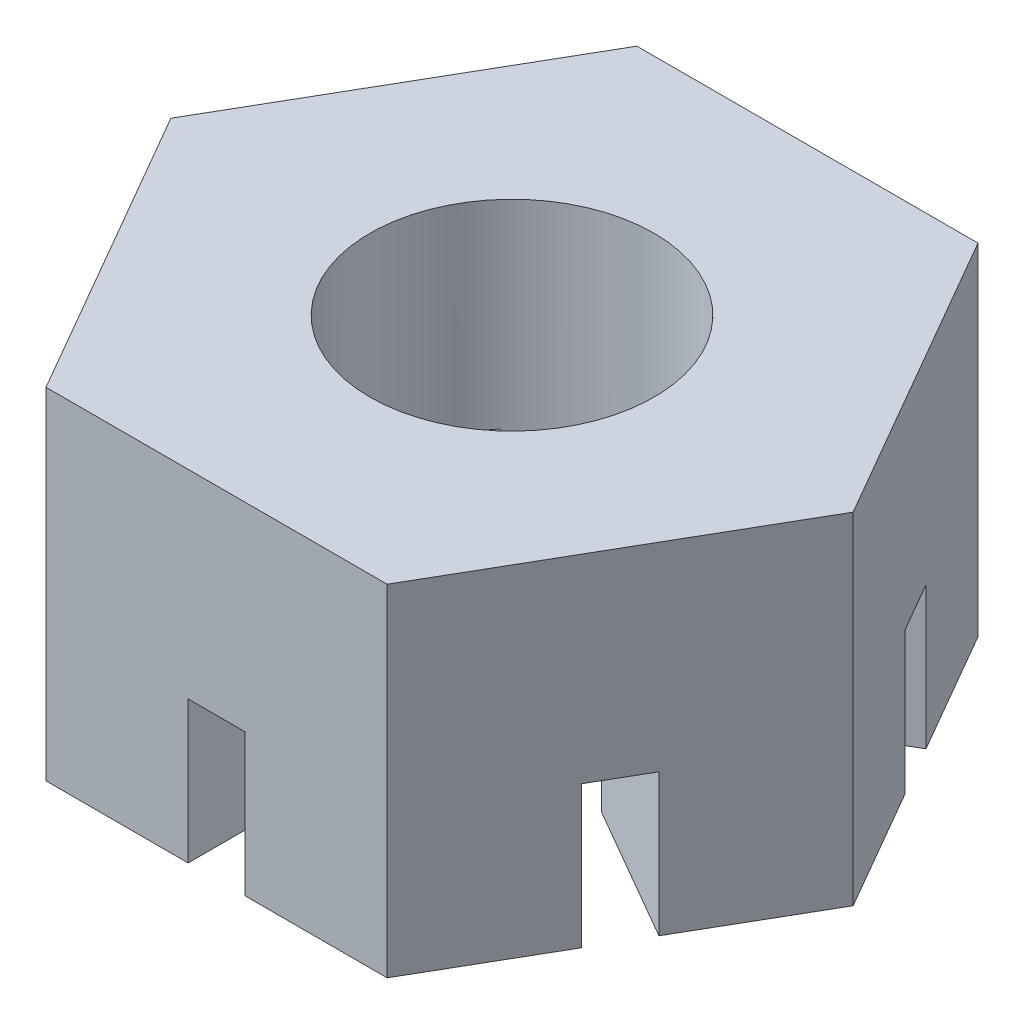
ISO-10303-21;
HEADER;
FILE_DESCRIPTION(('STEP AP214'),'2;1');
FILE_NAME('part.step','',(''),(''),'','','');
FILE_SCHEMA(('AUTOMOTIVE_DESIGN { 1 0 10303 214 1 1 1 1 }'));
ENDSEC;
DATA;
#1=APPLICATION_CONTEXT('core data for automotive mechanical design processes');
#2=APPLICATION_PROTOCOL_DEFINITION('international standard','automotive_design',2000,#1);
#3=PRODUCT_CONTEXT('',#1,'mechanical');
#4=PRODUCT('Part','Part','',(#3));
#5=PRODUCT_RELATED_PRODUCT_CATEGORY('part','',(#4));
#6=PRODUCT_DEFINITION_FORMATION('','',#4);
#7=PRODUCT_DEFINITION_CONTEXT('part definition',#1,'design');
#8=PRODUCT_DEFINITION('design','',#6,#7);
#9=PRODUCT_DEFINITION_SHAPE('','',#8);
#10=(LENGTH_UNIT() NAMED_UNIT(*) SI_UNIT(.MILLI.,.METRE.));
#11=(NAMED_UNIT(*) PLANE_ANGLE_UNIT() SI_UNIT($,.RADIAN.));
#12=(NAMED_UNIT(*) SI_UNIT($,.STERADIAN.) SOLID_ANGLE_UNIT());
#13=UNCERTAINTY_MEASURE_WITH_UNIT(LENGTH_MEASURE(1.E-05),#10,'distance_accuracy_value','');
#14=(GEOMETRIC_REPRESENTATION_CONTEXT(3) GLOBAL_UNCERTAINTY_ASSIGNED_CONTEXT((#13)) GLOBAL_UNIT_ASSIGNED_CONTEXT((#10,
#11,#12)) REPRESENTATION_CONTEXT('',''));
#15=CARTESIAN_POINT('',(0.,0.,0.));
#16=DIRECTION('',(0.,0.,1.));
#17=DIRECTION('',(1.,0.,0.));
#18=AXIS2_PLACEMENT_3D('',#15,#16,#17);
#19=CARTESIAN_POINT('',(0.,0.,0.));
#20=DIRECTION('',(0.,1.,0.));
#21=DIRECTION('',(0.,0.,1.));
#22=AXIS2_PLACEMENT_3D('',#19,#20,#21);
#23=PLANE('',#22);
#24=DIRECTION('',(0.866025403784438,0.,-0.500000000000001));
#25=VECTOR('',#24,1.);
#26=CARTESIAN_POINT('',(2.50000000000116,0.,4.33012701892419));
#27=LINE('',#26,#25);
#28=CARTESIAN_POINT('',(-42.5333209967897,0.,30.3301270189242));
#29=VERTEX_POINT('',#28);
#30=CARTESIAN_POINT('',(-18.7132034355949,0.,16.5775757328399));
#31=VERTEX_POINT('',#30);
#32=EDGE_CURVE('E281',#29,#31,#27,.T.);
#33=ORIENTED_EDGE('',*,*,#32,.T.);
#34=CARTESIAN_POINT('',(0.,0.,0.));
#35=DIRECTION('',(0.,1.,0.));
#36=DIRECTION('',(0.,0.,1.));
#37=AXIS2_PLACEMENT_3D('',#34,#35,#36);
#38=CIRCLE('',#37,25.);
#39=CARTESIAN_POINT('',(-4.99999999999651,0.,24.4948974278311));
#40=VERTEX_POINT('',#39);
#41=EDGE_CURVE('E401',#31,#40,#38,.T.);
#42=ORIENTED_EDGE('',*,*,#41,.T.);
#43=DIRECTION('',(0.,0.,-1.));
#44=VECTOR('',#43,1.);
#45=CARTESIAN_POINT('',(-4.99999999999652,0.,0.));
#46=LINE('',#45,#44);
#47=CARTESIAN_POINT('',(-4.99999999999651,0.,52.));
#48=VERTEX_POINT('',#47);
#49=EDGE_CURVE('E315',#48,#40,#46,.T.);
#50=ORIENTED_EDGE('',*,*,#49,.F.);
#51=DIRECTION('',(1.,0.,0.));
#52=VECTOR('',#51,1.);
#53=CARTESIAN_POINT('',(0.,0.,52.));
#54=LINE('',#53,#52);
#55=CARTESIAN_POINT('',(-30.0222139978606,0.,52.));
#56=VERTEX_POINT('',#55);
#57=EDGE_CURVE('E406',#56,#48,#54,.T.);
#58=ORIENTED_EDGE('',*,*,#57,.F.);
#59=DIRECTION('',(0.5,0.,0.866025403784439));
#60=VECTOR('',#59,1.);
#61=CARTESIAN_POINT('',(-45.0333209967908,0.,26.));
#62=LINE('',#61,#60);
#63=EDGE_CURVE('E440',#29,#56,#62,.T.);
#64=ORIENTED_EDGE('',*,*,#63,.F.);
#65=EDGE_LOOP('',(#33,#42,#50,#58,#64));
#66=FACE_BOUND('',#65,.T.);
#67=ADVANCED_FACE('F39',(#66),#23,.F.);
#68=DIRECTION('',(0.,0.,-1.));
#69=VECTOR('',#68,1.);
#70=CARTESIAN_POINT('',(5.00000000000348,0.,0.));
#71=LINE('',#70,#69);
#72=CARTESIAN_POINT('',(5.00000000000349,0.,52.));
#73=VERTEX_POINT('',#72);
#74=CARTESIAN_POINT('',(5.00000000000349,0.,24.4948974278311));
#75=VERTEX_POINT('',#74);
#76=EDGE_CURVE('E306',#73,#75,#71,.T.);
#77=ORIENTED_EDGE('',*,*,#76,.T.);
#78=CARTESIAN_POINT('',(18.7132034355987,0.,16.5775757328361));
#79=VERTEX_POINT('',#78);
#80=EDGE_CURVE('E420',#75,#79,#38,.T.);
#81=ORIENTED_EDGE('',*,*,#80,.T.);
#82=DIRECTION('',(-0.866025403784439,0.,-0.5));
#83=VECTOR('',#82,1.);
#84=CARTESIAN_POINT('',(-2.49999999999855,0.,4.33012701891968));
#85=LINE('',#84,#83);
#86=CARTESIAN_POINT('',(42.5333209967923,0.,30.3301270189197));
#87=VERTEX_POINT('',#86);
#88=EDGE_CURVE('E341',#87,#79,#85,.T.);
#89=ORIENTED_EDGE('',*,*,#88,.F.);
#90=DIRECTION('',(0.5,0.,-0.866025403784439));
#91=VECTOR('',#90,1.);
#92=CARTESIAN_POINT('',(45.0333209967908,0.,26.));
#93=LINE('',#92,#91);
#94=CARTESIAN_POINT('',(30.0222139978606,0.,52.));
#95=VERTEX_POINT('',#94);
#96=EDGE_CURVE('E425',#95,#87,#93,.T.);
#97=ORIENTED_EDGE('',*,*,#96,.F.);
#98=EDGE_CURVE('E444',#73,#95,#54,.T.);
#99=ORIENTED_EDGE('',*,*,#98,.F.);
#100=EDGE_LOOP('',(#77,#81,#89,#97,#99));
#101=FACE_BOUND('',#100,.T.);
#102=ADVANCED_FACE('F543',(#101),#23,.F.);
#103=DIRECTION('',(-0.866025403784439,0.,-0.5));
#104=VECTOR('',#103,1.);
#105=CARTESIAN_POINT('',(2.50000000000145,0.,-4.33012701892471));
#106=LINE('',#105,#104);
#107=CARTESIAN_POINT('',(47.5333209967923,0.,21.6698729810753));
#108=VERTEX_POINT('',#107);
#109=CARTESIAN_POINT('',(23.7132034355974,0.,7.91732169499087));
#110=VERTEX_POINT('',#109);
#111=EDGE_CURVE('E332',#108,#110,#106,.T.);
#112=ORIENTED_EDGE('',*,*,#111,.T.);
#113=CARTESIAN_POINT('',(23.7132034355964,0.,-7.91732169499363));
#114=VERTEX_POINT('',#113);
#115=EDGE_CURVE('E424',#110,#114,#38,.T.);
#116=ORIENTED_EDGE('',*,*,#115,.T.);
#117=DIRECTION('',(-0.86602540378444,0.,0.499999999999998));
#118=VECTOR('',#117,1.);
#119=CARTESIAN_POINT('',(2.5,0.,4.33012701892221));
#120=LINE('',#119,#118);
#121=CARTESIAN_POINT('',(47.5333209967909,0.,-21.6698729810777));
#122=VERTEX_POINT('',#121);
#123=EDGE_CURVE('E247',#122,#114,#120,.T.);
#124=ORIENTED_EDGE('',*,*,#123,.F.);
#125=DIRECTION('',(-0.5,0.,-0.866025403784439));
#126=VECTOR('',#125,1.);
#127=CARTESIAN_POINT('',(45.0333209967908,0.,-26.));
#128=LINE('',#127,#126);
#129=CARTESIAN_POINT('',(60.0444279957211,0.,0.));
#130=VERTEX_POINT('',#129);
#131=EDGE_CURVE('E429',#130,#122,#128,.T.);
#132=ORIENTED_EDGE('',*,*,#131,.F.);
#133=EDGE_CURVE('E423',#108,#130,#93,.T.);
#134=ORIENTED_EDGE('',*,*,#133,.F.);
#135=EDGE_LOOP('',(#112,#116,#124,#132,#134));
#136=FACE_BOUND('',#135,.T.);
#137=ADVANCED_FACE('F548',(#136),#23,.F.);
#138=DIRECTION('',(-0.86602540378444,0.,0.499999999999998));
#139=VECTOR('',#138,1.);
#140=CARTESIAN_POINT('',(-2.49999999999998,0.,-4.33012701892218));
#141=LINE('',#140,#139);
#142=CARTESIAN_POINT('',(42.5333209967909,0.,-30.3301270189221));
#143=VERTEX_POINT('',#142);
#144=CARTESIAN_POINT('',(18.7132034355965,0.,-16.577575732838));
#145=VERTEX_POINT('',#144);
#146=EDGE_CURVE('E358',#143,#145,#141,.T.);
#147=ORIENTED_EDGE('',*,*,#146,.T.);
#148=CARTESIAN_POINT('',(5.00000000000001,0.,-24.4948974278318));
#149=VERTEX_POINT('',#148);
#150=EDGE_CURVE('E468',#145,#149,#38,.T.);
#151=ORIENTED_EDGE('',*,*,#150,.T.);
#152=DIRECTION('',(0.,0.,1.));
#153=VECTOR('',#152,1.);
#154=CARTESIAN_POINT('',(5.00000000000001,0.,0.));
#155=LINE('',#154,#153);
#156=CARTESIAN_POINT('',(5.00000000000001,0.,-52.));
#157=VERTEX_POINT('',#156);
#158=EDGE_CURVE('E242',#157,#149,#155,.T.);
#159=ORIENTED_EDGE('',*,*,#158,.F.);
#160=DIRECTION('',(-1.,0.,0.));
#161=VECTOR('',#160,1.);
#162=CARTESIAN_POINT('',(0.,0.,-52.));
#163=LINE('',#162,#161);
#164=CARTESIAN_POINT('',(30.0222139978606,0.,-52.));
#165=VERTEX_POINT('',#164);
#166=EDGE_CURVE('E433',#165,#157,#163,.T.);
#167=ORIENTED_EDGE('',*,*,#166,.F.);
#168=EDGE_CURVE('E428',#143,#165,#128,.T.);
#169=ORIENTED_EDGE('',*,*,#168,.F.);
#170=EDGE_LOOP('',(#147,#151,#159,#167,#169));
#171=FACE_BOUND('',#170,.T.);
#172=ADVANCED_FACE('F467',(#171),#23,.F.);
#173=DIRECTION('',(0.,0.,1.));
#174=VECTOR('',#173,1.);
#175=CARTESIAN_POINT('',(-4.99999999999999,0.,0.));
#176=LINE('',#175,#174);
#177=CARTESIAN_POINT('',(-4.99999999999999,0.,-52.));
#178=VERTEX_POINT('',#177);
#179=CARTESIAN_POINT('',(-4.99999999999999,0.,-24.4948974278318));
#180=VERTEX_POINT('',#179);
#181=EDGE_CURVE('E263',#178,#180,#176,.T.);
#182=ORIENTED_EDGE('',*,*,#181,.T.);
#183=CARTESIAN_POINT('',(-18.7132034355962,0.,-16.5775757328383));
#184=VERTEX_POINT('',#183);
#185=EDGE_CURVE('E470',#180,#184,#38,.T.);
#186=ORIENTED_EDGE('',*,*,#185,.T.);
#187=DIRECTION('',(0.866025403784433,0.,0.50000000000001));
#188=VECTOR('',#187,1.);
#189=CARTESIAN_POINT('',(2.50000000000006,0.,-4.33012701892217));
#190=LINE('',#189,#188);
#191=CARTESIAN_POINT('',(-42.5333209967905,0.,-30.3301270189227));
#192=VERTEX_POINT('',#191);
#193=EDGE_CURVE('E301',#192,#184,#190,.T.);
#194=ORIENTED_EDGE('',*,*,#193,.F.);
#195=DIRECTION('',(-0.5,0.,0.866025403784439));
#196=VECTOR('',#195,1.);
#197=CARTESIAN_POINT('',(-45.0333209967908,0.,-26.));
#198=LINE('',#197,#196);
#199=CARTESIAN_POINT('',(-30.0222139978606,0.,-52.));
#200=VERTEX_POINT('',#199);
#201=EDGE_CURVE('E437',#200,#192,#198,.T.);
#202=ORIENTED_EDGE('',*,*,#201,.F.);
#203=EDGE_CURVE('E432',#178,#200,#163,.T.);
#204=ORIENTED_EDGE('',*,*,#203,.F.);
#205=EDGE_LOOP('',(#182,#186,#194,#202,#204));
#206=FACE_BOUND('',#205,.T.);
#207=ADVANCED_FACE('F529',(#206),#23,.F.);
#208=CARTESIAN_POINT('',(45.0333209967908,60.,26.));
#209=DIRECTION('',(-0.866025403784439,0.,-0.5));
#210=DIRECTION('',(-0.5,0.,0.866025403784439));
#211=AXIS2_PLACEMENT_3D('',#208,#209,#210);
#212=PLANE('',#211);
#213=ORIENTED_EDGE('',*,*,#96,.T.);
#214=DIRECTION('',(0.,-1.,0.));
#215=VECTOR('',#214,1.);
#216=CARTESIAN_POINT('',(42.5333209967923,25.,30.3301270189197));
#217=LINE('',#216,#215);
#218=CARTESIAN_POINT('',(42.5333209967923,25.,30.3301270189197));
#219=VERTEX_POINT('',#218);
#220=EDGE_CURVE('E350',#219,#87,#217,.T.);
#221=ORIENTED_EDGE('',*,*,#220,.F.);
#222=DIRECTION('',(0.5,0.,-0.866025403784439));
#223=VECTOR('',#222,1.);
#224=CARTESIAN_POINT('',(45.0333209967908,25.,26.));
#225=LINE('',#224,#223);
#226=CARTESIAN_POINT('',(47.5333209967923,25.,21.6698729810753));
#227=VERTEX_POINT('',#226);
#228=EDGE_CURVE('E335',#219,#227,#225,.T.);
#229=ORIENTED_EDGE('',*,*,#228,.T.);
#230=DIRECTION('',(0.,-1.,0.));
#231=VECTOR('',#230,1.);
#232=CARTESIAN_POINT('',(47.5333209967923,25.,21.6698729810753));
#233=LINE('',#232,#231);
#234=EDGE_CURVE('E347',#227,#108,#233,.T.);
#235=ORIENTED_EDGE('',*,*,#234,.T.);
#236=ORIENTED_EDGE('',*,*,#133,.T.);
#237=DIRECTION('',(0.,-1.,0.));
#238=VECTOR('',#237,1.);
#239=CARTESIAN_POINT('',(60.0444279957211,60.,0.));
#240=LINE('',#239,#238);
#241=CARTESIAN_POINT('',(60.0444279957211,60.,0.));
#242=VERTEX_POINT('',#241);
#243=EDGE_CURVE('E11',#242,#130,#240,.T.);
#244=ORIENTED_EDGE('',*,*,#243,.F.);
#245=DIRECTION('',(0.5,0.,-0.866025403784439));
#246=VECTOR('',#245,1.);
#247=CARTESIAN_POINT('',(45.0333209967908,60.,26.));
#248=LINE('',#247,#246);
#249=CARTESIAN_POINT('',(30.0222139978606,60.,52.));
#250=VERTEX_POINT('',#249);
#251=EDGE_CURVE('E405',#250,#242,#248,.T.);
#252=ORIENTED_EDGE('',*,*,#251,.F.);
#253=DIRECTION('',(0.,-1.,0.));
#254=VECTOR('',#253,1.);
#255=CARTESIAN_POINT('',(30.0222139978606,60.,52.));
#256=LINE('',#255,#254);
#257=EDGE_CURVE('E419',#250,#95,#256,.T.);
#258=ORIENTED_EDGE('',*,*,#257,.T.);
#259=EDGE_LOOP('',(#213,#221,#229,#235,#236,#244,#252,#258));
#260=FACE_BOUND('',#259,.T.);
#261=ADVANCED_FACE('F561',(#260),#212,.F.);
#262=CARTESIAN_POINT('',(45.0333209967908,60.,-26.));
#263=DIRECTION('',(-0.866025403784439,0.,0.5));
#264=DIRECTION('',(0.5,0.,0.866025403784439));
#265=AXIS2_PLACEMENT_3D('',#262,#263,#264);
#266=PLANE('',#265);
#267=ORIENTED_EDGE('',*,*,#131,.T.);
#268=DIRECTION('',(0.,-1.,0.));
#269=VECTOR('',#268,1.);
#270=CARTESIAN_POINT('',(47.5333209967909,25.,-21.6698729810777));
#271=LINE('',#270,#269);
#272=CARTESIAN_POINT('',(47.5333209967909,25.,-21.6698729810777));
#273=VERTEX_POINT('',#272);
#274=EDGE_CURVE('E374',#273,#122,#271,.T.);
#275=ORIENTED_EDGE('',*,*,#274,.F.);
#276=DIRECTION('',(-0.5,0.,-0.866025403784439));
#277=VECTOR('',#276,1.);
#278=CARTESIAN_POINT('',(45.0333209967908,25.,-26.));
#279=LINE('',#278,#277);
#280=CARTESIAN_POINT('',(42.5333209967909,25.,-30.3301270189221));
#281=VERTEX_POINT('',#280);
#282=EDGE_CURVE('E361',#273,#281,#279,.T.);
#283=ORIENTED_EDGE('',*,*,#282,.T.);
#284=DIRECTION('',(0.,-1.,0.));
#285=VECTOR('',#284,1.);
#286=CARTESIAN_POINT('',(42.5333209967909,25.,-30.3301270189221));
#287=LINE('',#286,#285);
#288=EDGE_CURVE('E371',#281,#143,#287,.T.);
#289=ORIENTED_EDGE('',*,*,#288,.T.);
#290=ORIENTED_EDGE('',*,*,#168,.T.);
#291=DIRECTION('',(0.,-1.,0.));
#292=VECTOR('',#291,1.);
#293=CARTESIAN_POINT('',(30.0222139978606,60.,-52.));
#294=LINE('',#293,#292);
#295=CARTESIAN_POINT('',(30.0222139978606,60.,-52.));
#296=VERTEX_POINT('',#295);
#297=EDGE_CURVE('E47',#296,#165,#294,.T.);
#298=ORIENTED_EDGE('',*,*,#297,.F.);
#299=DIRECTION('',(-0.5,0.,-0.866025403784439));
#300=VECTOR('',#299,1.);
#301=CARTESIAN_POINT('',(45.0333209967908,60.,-26.));
#302=LINE('',#301,#300);
#303=EDGE_CURVE('E409',#242,#296,#302,.T.);
#304=ORIENTED_EDGE('',*,*,#303,.F.);
#305=ORIENTED_EDGE('',*,*,#243,.T.);
#306=EDGE_LOOP('',(#267,#275,#283,#289,#290,#298,#304,#305));
#307=FACE_BOUND('',#306,.T.);
#308=ADVANCED_FACE('F566',(#307),#266,.F.);
#309=CARTESIAN_POINT('',(0.,60.,-52.));
#310=DIRECTION('',(0.,0.,1.));
#311=DIRECTION('',(1.,0.,0.));
#312=AXIS2_PLACEMENT_3D('',#309,#310,#311);
#313=PLANE('',#312);
#314=ORIENTED_EDGE('',*,*,#166,.T.);
#315=DIRECTION('',(0.,-1.,0.));
#316=VECTOR('',#315,1.);
#317=CARTESIAN_POINT('',(5.00000000000001,25.,-52.));
#318=LINE('',#317,#316);
#319=CARTESIAN_POINT('',(5.00000000000001,25.,-52.));
#320=VERTEX_POINT('',#319);
#321=EDGE_CURVE('E248',#320,#157,#318,.T.);
#322=ORIENTED_EDGE('',*,*,#321,.F.);
#323=DIRECTION('',(-1.,0.,0.));
#324=VECTOR('',#323,1.);
#325=CARTESIAN_POINT('',(0.,25.,-52.));
#326=LINE('',#325,#324);
#327=CARTESIAN_POINT('',(-4.99999999999999,25.,-52.));
#328=VERTEX_POINT('',#327);
#329=EDGE_CURVE('E257',#320,#328,#326,.T.);
#330=ORIENTED_EDGE('',*,*,#329,.T.);
#331=DIRECTION('',(0.,-1.,0.));
#332=VECTOR('',#331,1.);
#333=CARTESIAN_POINT('',(-4.99999999999999,25.,-52.));
#334=LINE('',#333,#332);
#335=EDGE_CURVE('E273',#328,#178,#334,.T.);
#336=ORIENTED_EDGE('',*,*,#335,.T.);
#337=ORIENTED_EDGE('',*,*,#203,.T.);
#338=DIRECTION('',(0.,-1.,0.));
#339=VECTOR('',#338,1.);
#340=CARTESIAN_POINT('',(-30.0222139978606,60.,-52.));
#341=LINE('',#340,#339);
#342=CARTESIAN_POINT('',(-30.0222139978606,60.,-52.));
#343=VERTEX_POINT('',#342);
#344=EDGE_CURVE('E455',#343,#200,#341,.T.);
#345=ORIENTED_EDGE('',*,*,#344,.F.);
#346=DIRECTION('',(-1.,0.,0.));
#347=VECTOR('',#346,1.);
#348=CARTESIAN_POINT('',(0.,60.,-52.));
#349=LINE('',#348,#347);
#350=EDGE_CURVE('E411',#296,#343,#349,.T.);
#351=ORIENTED_EDGE('',*,*,#350,.F.);
#352=ORIENTED_EDGE('',*,*,#297,.T.);
#353=EDGE_LOOP('',(#314,#322,#330,#336,#337,#345,#351,#352));
#354=FACE_BOUND('',#353,.T.);
#355=ADVANCED_FACE('F462',(#354),#313,.F.);
#356=CARTESIAN_POINT('',(-45.0333209967908,60.,-26.));
#357=DIRECTION('',(0.866025403784439,0.,0.5));
#358=DIRECTION('',(0.5,0.,-0.866025403784439));
#359=AXIS2_PLACEMENT_3D('',#356,#357,#358);
#360=PLANE('',#359);
#361=ORIENTED_EDGE('',*,*,#201,.T.);
#362=DIRECTION('',(0.,-1.,0.));
#363=VECTOR('',#362,1.);
#364=CARTESIAN_POINT('',(-42.5333209967905,25.,-30.3301270189227));
#365=LINE('',#364,#363);
#366=CARTESIAN_POINT('',(-42.5333209967905,25.,-30.3301270189227));
#367=VERTEX_POINT('',#366);
#368=EDGE_CURVE('E396',#367,#192,#365,.T.);
#369=ORIENTED_EDGE('',*,*,#368,.F.);
#370=DIRECTION('',(-0.5,0.,0.866025403784439));
#371=VECTOR('',#370,1.);
#372=CARTESIAN_POINT('',(-45.0333209967908,25.,-26.));
#373=LINE('',#372,#371);
#374=CARTESIAN_POINT('',(-47.5333209967905,25.,-21.6698729810783));
#375=VERTEX_POINT('',#374);
#376=EDGE_CURVE('E385',#367,#375,#373,.T.);
#377=ORIENTED_EDGE('',*,*,#376,.T.);
#378=DIRECTION('',(0.,-1.,0.));
#379=VECTOR('',#378,1.);
#380=CARTESIAN_POINT('',(-47.5333209967905,25.,-21.6698729810783));
#381=LINE('',#380,#379);
#382=CARTESIAN_POINT('',(-47.5333209967905,0.,-21.6698729810783));
#383=VERTEX_POINT('',#382);
#384=EDGE_CURVE('E393',#375,#383,#381,.T.);
#385=ORIENTED_EDGE('',*,*,#384,.T.);
#386=CARTESIAN_POINT('',(-60.0444279957211,0.,0.));
#387=VERTEX_POINT('',#386);
#388=EDGE_CURVE('E436',#383,#387,#198,.T.);
#389=ORIENTED_EDGE('',*,*,#388,.T.);
#390=DIRECTION('',(0.,-1.,0.));
#391=VECTOR('',#390,1.);
#392=CARTESIAN_POINT('',(-60.0444279957211,60.,0.));
#393=LINE('',#392,#391);
#394=CARTESIAN_POINT('',(-60.0444279957211,60.,0.));
#395=VERTEX_POINT('',#394);
#396=EDGE_CURVE('E452',#395,#387,#393,.T.);
#397=ORIENTED_EDGE('',*,*,#396,.F.);
#398=DIRECTION('',(-0.5,0.,0.866025403784439));
#399=VECTOR('',#398,1.);
#400=CARTESIAN_POINT('',(-45.0333209967908,60.,-26.));
#401=LINE('',#400,#399);
#402=EDGE_CURVE('E413',#343,#395,#401,.T.);
#403=ORIENTED_EDGE('',*,*,#402,.F.);
#404=ORIENTED_EDGE('',*,*,#344,.T.);
#405=EDGE_LOOP('',(#361,#369,#377,#385,#389,#397,#403,#404));
#406=FACE_BOUND('',#405,.T.);
#407=ADVANCED_FACE('F518',(#406),#360,.F.);
#408=CARTESIAN_POINT('',(-45.0333209967908,60.,26.));
#409=DIRECTION('',(0.866025403784439,0.,-0.5));
#410=DIRECTION('',(-0.5,0.,-0.866025403784439));
#411=AXIS2_PLACEMENT_3D('',#408,#409,#410);
#412=PLANE('',#411);
#413=CARTESIAN_POINT('',(-47.5333209967897,0.,21.6698729810799));
#414=VERTEX_POINT('',#413);
#415=EDGE_CURVE('E441',#387,#414,#62,.T.);
#416=ORIENTED_EDGE('',*,*,#415,.T.);
#417=DIRECTION('',(0.,-1.,0.));
#418=VECTOR('',#417,1.);
#419=CARTESIAN_POINT('',(-47.5333209967897,25.,21.6698729810799));
#420=LINE('',#419,#418);
#421=CARTESIAN_POINT('',(-47.5333209967897,25.,21.6698729810799));
#422=VERTEX_POINT('',#421);
#423=EDGE_CURVE('E297',#422,#414,#420,.T.);
#424=ORIENTED_EDGE('',*,*,#423,.F.);
#425=DIRECTION('',(0.5,0.,0.866025403784439));
#426=VECTOR('',#425,1.);
#427=CARTESIAN_POINT('',(-45.0333209967908,25.,26.));
#428=LINE('',#427,#426);
#429=CARTESIAN_POINT('',(-42.5333209967897,25.,30.3301270189242));
#430=VERTEX_POINT('',#429);
#431=EDGE_CURVE('E284',#422,#430,#428,.T.);
#432=ORIENTED_EDGE('',*,*,#431,.T.);
#433=DIRECTION('',(0.,-1.,0.));
#434=VECTOR('',#433,1.);
#435=CARTESIAN_POINT('',(-42.5333209967897,25.,30.3301270189242));
#436=LINE('',#435,#434);
#437=EDGE_CURVE('E294',#430,#29,#436,.T.);
#438=ORIENTED_EDGE('',*,*,#437,.T.);
#439=ORIENTED_EDGE('',*,*,#63,.T.);
#440=DIRECTION('',(0.,-1.,0.));
#441=VECTOR('',#440,1.);
#442=CARTESIAN_POINT('',(-30.0222139978606,60.,52.));
#443=LINE('',#442,#441);
#444=CARTESIAN_POINT('',(-30.0222139978606,60.,52.));
#445=VERTEX_POINT('',#444);
#446=EDGE_CURVE('E449',#445,#56,#443,.T.);
#447=ORIENTED_EDGE('',*,*,#446,.F.);
#448=DIRECTION('',(0.5,0.,0.866025403784439));
#449=VECTOR('',#448,1.);
#450=CARTESIAN_POINT('',(-45.0333209967908,60.,26.));
#451=LINE('',#450,#449);
#452=EDGE_CURVE('E415',#395,#445,#451,.T.);
#453=ORIENTED_EDGE('',*,*,#452,.F.);
#454=ORIENTED_EDGE('',*,*,#396,.T.);
#455=EDGE_LOOP('',(#416,#424,#432,#438,#439,#447,#453,#454));
#456=FACE_BOUND('',#455,.T.);
#457=ADVANCED_FACE('F502',(#456),#412,.F.);
#458=CARTESIAN_POINT('',(0.,60.,0.));
#459=DIRECTION('',(0.,-1.,0.));
#460=DIRECTION('',(0.,0.,-1.));
#461=AXIS2_PLACEMENT_3D('',#458,#459,#460);
#462=CYLINDRICAL_SURFACE('',#461,25.);
#463=DIRECTION('',(0.,-1.,0.));
#464=VECTOR('',#463,1.);
#465=CARTESIAN_POINT('',(-23.7132034355935,25.,7.91732169499469));
#466=LINE('',#465,#464);
#467=CARTESIAN_POINT('',(-23.7132034355935,25.,7.91732169499469));
#468=VERTEX_POINT('',#467);
#469=CARTESIAN_POINT('',(-23.7132034355935,0.,7.91732169499469));
#470=VERTEX_POINT('',#469);
#471=EDGE_CURVE('E299',#468,#470,#466,.T.);
#472=ORIENTED_EDGE('',*,*,#471,.T.);
#473=CARTESIAN_POINT('',(-23.7132034355963,0.,-7.91732169499398));
#474=VERTEX_POINT('',#473);
#475=EDGE_CURVE('E473',#474,#470,#38,.T.);
#476=ORIENTED_EDGE('',*,*,#475,.F.);
#477=DIRECTION('',(0.,-1.,0.));
#478=VECTOR('',#477,1.);
#479=CARTESIAN_POINT('',(-23.7132034355963,25.,-7.91732169499398));
#480=LINE('',#479,#478);
#481=CARTESIAN_POINT('',(-23.7132034355963,25.,-7.91732169499398));
#482=VERTEX_POINT('',#481);
#483=EDGE_CURVE('E62',#482,#474,#480,.T.);
#484=ORIENTED_EDGE('',*,*,#483,.F.);
#485=CARTESIAN_POINT('',(0.,25.,0.));
#486=DIRECTION('',(0.,1.,0.));
#487=DIRECTION('',(0.,0.,1.));
#488=AXIS2_PLACEMENT_3D('',#485,#486,#487);
#489=CIRCLE('',#488,25.);
#490=CARTESIAN_POINT('',(-18.7132034355962,25.,-16.5775757328383));
#491=VERTEX_POINT('',#490);
#492=EDGE_CURVE('E378',#491,#482,#489,.T.);
#493=ORIENTED_EDGE('',*,*,#492,.F.);
#494=DIRECTION('',(0.,-1.,0.));
#495=VECTOR('',#494,1.);
#496=CARTESIAN_POINT('',(-18.7132034355962,25.,-16.5775757328383));
#497=LINE('',#496,#495);
#498=EDGE_CURVE('E398',#491,#184,#497,.T.);
#499=ORIENTED_EDGE('',*,*,#498,.T.);
#500=ORIENTED_EDGE('',*,*,#185,.F.);
#501=DIRECTION('',(0.,-1.,0.));
#502=VECTOR('',#501,1.);
#503=CARTESIAN_POINT('',(-4.99999999999999,25.,-24.4948974278318));
#504=LINE('',#503,#502);
#505=CARTESIAN_POINT('',(-4.99999999999999,25.,-24.4948974278318));
#506=VERTEX_POINT('',#505);
#507=EDGE_CURVE('E262',#506,#180,#504,.T.);
#508=ORIENTED_EDGE('',*,*,#507,.F.);
#509=CARTESIAN_POINT('',(0.,25.,0.));
#510=DIRECTION('',(0.,1.,0.));
#511=DIRECTION('',(0.,0.,1.));
#512=AXIS2_PLACEMENT_3D('',#509,#510,#511);
#513=CIRCLE('',#512,25.);
#514=CARTESIAN_POINT('',(5.00000000000001,25.,-24.4948974278318));
#515=VERTEX_POINT('',#514);
#516=EDGE_CURVE('E254',#515,#506,#513,.T.);
#517=ORIENTED_EDGE('',*,*,#516,.F.);
#518=DIRECTION('',(0.,-1.,0.));
#519=VECTOR('',#518,1.);
#520=CARTESIAN_POINT('',(5.00000000000001,25.,-24.4948974278318));
#521=LINE('',#520,#519);
#522=EDGE_CURVE('E236',#515,#149,#521,.T.);
#523=ORIENTED_EDGE('',*,*,#522,.T.);
#524=ORIENTED_EDGE('',*,*,#150,.F.);
#525=DIRECTION('',(0.,-1.,0.));
#526=VECTOR('',#525,1.);
#527=CARTESIAN_POINT('',(18.7132034355965,25.,-16.577575732838));
#528=LINE('',#527,#526);
#529=CARTESIAN_POINT('',(18.7132034355965,25.,-16.577575732838));
#530=VERTEX_POINT('',#529);
#531=EDGE_CURVE('E366',#530,#145,#528,.T.);
#532=ORIENTED_EDGE('',*,*,#531,.F.);
#533=CARTESIAN_POINT('',(0.,25.,0.));
#534=DIRECTION('',(0.,1.,0.));
#535=DIRECTION('',(0.,0.,1.));
#536=AXIS2_PLACEMENT_3D('',#533,#534,#535);
#537=CIRCLE('',#536,25.);
#538=CARTESIAN_POINT('',(23.7132034355964,25.,-7.91732169499363));
#539=VERTEX_POINT('',#538);
#540=EDGE_CURVE('E354',#539,#530,#537,.T.);
#541=ORIENTED_EDGE('',*,*,#540,.F.);
#542=DIRECTION('',(0.,-1.,0.));
#543=VECTOR('',#542,1.);
#544=CARTESIAN_POINT('',(23.7132034355964,25.,-7.91732169499363));
#545=LINE('',#544,#543);
#546=EDGE_CURVE('E343',#539,#114,#545,.T.);
#547=ORIENTED_EDGE('',*,*,#546,.T.);
#548=ORIENTED_EDGE('',*,*,#115,.F.);
#549=DIRECTION('',(0.,-1.,0.));
#550=VECTOR('',#549,1.);
#551=CARTESIAN_POINT('',(23.7132034355987,25.,7.91732169499167));
#552=LINE('',#551,#550);
#553=CARTESIAN_POINT('',(23.7132034355987,25.,7.91732169499167));
#554=VERTEX_POINT('',#553);
#555=EDGE_CURVE('E340',#554,#110,#552,.T.);
#556=ORIENTED_EDGE('',*,*,#555,.F.);
#557=CARTESIAN_POINT('',(0.,25.,0.));
#558=DIRECTION('',(0.,1.,0.));
#559=DIRECTION('',(0.,0.,1.));
#560=AXIS2_PLACEMENT_3D('',#557,#558,#559);
#561=CIRCLE('',#560,25.);
#562=CARTESIAN_POINT('',(18.7132034355987,25.,16.5775757328361));
#563=VERTEX_POINT('',#562);
#564=EDGE_CURVE('E328',#563,#554,#561,.T.);
#565=ORIENTED_EDGE('',*,*,#564,.F.);
#566=DIRECTION('',(0.,-1.,0.));
#567=VECTOR('',#566,1.);
#568=CARTESIAN_POINT('',(18.7132034355987,25.,16.5775757328361));
#569=LINE('',#568,#567);
#570=EDGE_CURVE('E317',#563,#79,#569,.T.);
#571=ORIENTED_EDGE('',*,*,#570,.T.);
#572=ORIENTED_EDGE('',*,*,#80,.F.);
#573=DIRECTION('',(0.,-1.,0.));
#574=VECTOR('',#573,1.);
#575=CARTESIAN_POINT('',(5.00000000000349,25.,24.4948974278311));
#576=LINE('',#575,#574);
#577=CARTESIAN_POINT('',(5.00000000000349,25.,24.4948974278311));
#578=VERTEX_POINT('',#577);
#579=EDGE_CURVE('E314',#578,#75,#576,.T.);
#580=ORIENTED_EDGE('',*,*,#579,.F.);
#581=CARTESIAN_POINT('',(0.,25.,0.));
#582=DIRECTION('',(0.,1.,0.));
#583=DIRECTION('',(0.,0.,1.));
#584=AXIS2_PLACEMENT_3D('',#581,#582,#583);
#585=CIRCLE('',#584,25.);
#586=CARTESIAN_POINT('',(-4.99999999999651,25.,24.4948974278311));
#587=VERTEX_POINT('',#586);
#588=EDGE_CURVE('E302',#587,#578,#585,.T.);
#589=ORIENTED_EDGE('',*,*,#588,.F.);
#590=DIRECTION('',(0.,-1.,0.));
#591=VECTOR('',#590,1.);
#592=CARTESIAN_POINT('',(-4.99999999999651,25.,24.4948974278311));
#593=LINE('',#592,#591);
#594=EDGE_CURVE('E291',#587,#40,#593,.T.);
#595=ORIENTED_EDGE('',*,*,#594,.T.);
#596=ORIENTED_EDGE('',*,*,#41,.F.);
#597=DIRECTION('',(0.,-1.,0.));
#598=VECTOR('',#597,1.);
#599=CARTESIAN_POINT('',(-18.7132034355935,25.,16.5775757328391));
#600=LINE('',#599,#598);
#601=CARTESIAN_POINT('',(-18.7132034355935,25.,16.5775757328391));
#602=VERTEX_POINT('',#601);
#603=EDGE_CURVE('E54',#602,#31,#600,.T.);
#604=ORIENTED_EDGE('',*,*,#603,.F.);
#605=CARTESIAN_POINT('',(0.,25.,0.));
#606=DIRECTION('',(0.,1.,0.));
#607=DIRECTION('',(0.,0.,1.));
#608=AXIS2_PLACEMENT_3D('',#605,#606,#607);
#609=CIRCLE('',#608,25.);
#610=EDGE_CURVE('E277',#468,#602,#609,.T.);
#611=ORIENTED_EDGE('',*,*,#610,.F.);
#612=EDGE_LOOP('',(#472,#476,#484,#493,#499,#500,#508,#517,#523,#524,#532,#541,#547,#548,#556,
#565,#571,#572,#580,#589,#595,#596,#604,#611));
#613=FACE_BOUND('',#612,.T.);
#614=CARTESIAN_POINT('',(0.,60.,0.));
#615=DIRECTION('',(0.,1.,0.));
#616=DIRECTION('',(0.,0.,1.));
#617=AXIS2_PLACEMENT_3D('',#614,#615,#616);
#618=CIRCLE('',#617,25.);
#619=CARTESIAN_POINT('',(0.,60.,25.));
#620=VERTEX_POINT('',#619);
#621=EDGE_CURVE('E402',#620,#620,#618,.T.);
#622=ORIENTED_EDGE('',*,*,#621,.T.);
#623=EDGE_LOOP('',(#622));
#624=FACE_BOUND('',#623,.T.);
#625=ADVANCED_FACE('F41',(#613,#624),#462,.F.);
#626=CARTESIAN_POINT('',(0.,60.,52.));
#627=DIRECTION('',(0.,0.,-1.));
#628=DIRECTION('',(-1.,0.,0.));
#629=AXIS2_PLACEMENT_3D('',#626,#627,#628);
#630=PLANE('',#629);
#631=ORIENTED_EDGE('',*,*,#57,.T.);
#632=DIRECTION('',(0.,-1.,0.));
#633=VECTOR('',#632,1.);
#634=CARTESIAN_POINT('',(-4.99999999999651,25.,52.));
#635=LINE('',#634,#633);
#636=CARTESIAN_POINT('',(-4.99999999999651,25.,52.));
#637=VERTEX_POINT('',#636);
#638=EDGE_CURVE('E324',#637,#48,#635,.T.);
#639=ORIENTED_EDGE('',*,*,#638,.F.);
#640=DIRECTION('',(1.,0.,0.));
#641=VECTOR('',#640,1.);
#642=CARTESIAN_POINT('',(0.,25.,52.));
#643=LINE('',#642,#641);
#644=CARTESIAN_POINT('',(5.00000000000349,25.,52.));
#645=VERTEX_POINT('',#644);
#646=EDGE_CURVE('E309',#637,#645,#643,.T.);
#647=ORIENTED_EDGE('',*,*,#646,.T.);
#648=DIRECTION('',(0.,-1.,0.));
#649=VECTOR('',#648,1.);
#650=CARTESIAN_POINT('',(5.00000000000349,25.,52.));
#651=LINE('',#650,#649);
#652=EDGE_CURVE('E321',#645,#73,#651,.T.);
#653=ORIENTED_EDGE('',*,*,#652,.T.);
#654=ORIENTED_EDGE('',*,*,#98,.T.);
#655=ORIENTED_EDGE('',*,*,#257,.F.);
#656=DIRECTION('',(1.,0.,0.));
#657=VECTOR('',#656,1.);
#658=CARTESIAN_POINT('',(0.,60.,52.));
#659=LINE('',#658,#657);
#660=EDGE_CURVE('E417',#445,#250,#659,.T.);
#661=ORIENTED_EDGE('',*,*,#660,.F.);
#662=ORIENTED_EDGE('',*,*,#446,.T.);
#663=EDGE_LOOP('',(#631,#639,#647,#653,#654,#655,#661,#662));
#664=FACE_BOUND('',#663,.T.);
#665=ADVANCED_FACE('F497',(#664),#630,.F.);
#666=CARTESIAN_POINT('',(0.,60.,0.));
#667=DIRECTION('',(0.,1.,0.));
#668=DIRECTION('',(0.,0.,1.));
#669=AXIS2_PLACEMENT_3D('',#666,#667,#668);
#670=PLANE('',#669);
#671=ORIENTED_EDGE('',*,*,#621,.F.);
#672=EDGE_LOOP('',(#671));
#673=FACE_BOUND('',#672,.T.);
#674=ORIENTED_EDGE('',*,*,#251,.T.);
#675=ORIENTED_EDGE('',*,*,#303,.T.);
#676=ORIENTED_EDGE('',*,*,#350,.T.);
#677=ORIENTED_EDGE('',*,*,#402,.T.);
#678=ORIENTED_EDGE('',*,*,#452,.T.);
#679=ORIENTED_EDGE('',*,*,#660,.T.);
#680=EDGE_LOOP('',(#674,#675,#676,#677,#678,#679));
#681=FACE_BOUND('',#680,.T.);
#682=ADVANCED_FACE('F553',(#673,#681),#670,.T.);
#683=ORIENTED_EDGE('',*,*,#475,.T.);
#684=DIRECTION('',(0.866025403784438,0.,-0.500000000000001));
#685=VECTOR('',#684,1.);
#686=CARTESIAN_POINT('',(-2.49999999999885,0.,-4.3301270189202));
#687=LINE('',#686,#685);
#688=EDGE_CURVE('E289',#414,#470,#687,.T.);
#689=ORIENTED_EDGE('',*,*,#688,.F.);
#690=ORIENTED_EDGE('',*,*,#415,.F.);
#691=ORIENTED_EDGE('',*,*,#388,.F.);
#692=DIRECTION('',(0.866025403784433,0.,0.50000000000001));
#693=VECTOR('',#692,1.);
#694=CARTESIAN_POINT('',(-2.50000000000004,0.,4.33012701892215));
#695=LINE('',#694,#693);
#696=EDGE_CURVE('E382',#383,#474,#695,.T.);
#697=ORIENTED_EDGE('',*,*,#696,.T.);
#698=EDGE_LOOP('',(#683,#689,#690,#691,#697));
#699=FACE_BOUND('',#698,.T.);
#700=ADVANCED_FACE('F513',(#699),#23,.F.);
#701=CARTESIAN_POINT('',(2.50000000000006,25.,-4.33012701892217));
#702=DIRECTION('',(0.50000000000001,0.,-0.866025403784433));
#703=DIRECTION('',(-0.866025403784433,0.,-0.50000000000001));
#704=AXIS2_PLACEMENT_3D('',#701,#702,#703);
#705=PLANE('',#704);
#706=ORIENTED_EDGE('',*,*,#193,.T.);
#707=ORIENTED_EDGE('',*,*,#498,.F.);
#708=DIRECTION('',(0.866025403784433,0.,0.50000000000001));
#709=VECTOR('',#708,1.);
#710=CARTESIAN_POINT('',(2.50000000000006,25.,-4.33012701892217));
#711=LINE('',#710,#709);
#712=EDGE_CURVE('E381',#367,#491,#711,.T.);
#713=ORIENTED_EDGE('',*,*,#712,.F.);
#714=ORIENTED_EDGE('',*,*,#368,.T.);
#715=EDGE_LOOP('',(#706,#707,#713,#714));
#716=FACE_BOUND('',#715,.T.);
#717=ADVANCED_FACE('F528',(#716),#705,.F.);
#718=CARTESIAN_POINT('',(-2.50000000000004,25.,4.33012701892215));
#719=DIRECTION('',(0.50000000000001,0.,-0.866025403784433));
#720=DIRECTION('',(-0.866025403784433,0.,-0.50000000000001));
#721=AXIS2_PLACEMENT_3D('',#718,#719,#720);
#722=PLANE('',#721);
#723=ORIENTED_EDGE('',*,*,#696,.F.);
#724=ORIENTED_EDGE('',*,*,#384,.F.);
#725=DIRECTION('',(0.866025403784433,0.,0.50000000000001));
#726=VECTOR('',#725,1.);
#727=CARTESIAN_POINT('',(-2.50000000000004,25.,4.33012701892215));
#728=LINE('',#727,#726);
#729=EDGE_CURVE('E388',#375,#482,#728,.T.);
#730=ORIENTED_EDGE('',*,*,#729,.T.);
#731=ORIENTED_EDGE('',*,*,#483,.T.);
#732=EDGE_LOOP('',(#723,#724,#730,#731));
#733=FACE_BOUND('',#732,.T.);
#734=ADVANCED_FACE('F519',(#733),#722,.T.);
#735=CARTESIAN_POINT('',(0.,25.,0.));
#736=DIRECTION('',(0.,1.,0.));
#737=DIRECTION('',(0.,0.,1.));
#738=AXIS2_PLACEMENT_3D('',#735,#736,#737);
#739=PLANE('',#738);
#740=ORIENTED_EDGE('',*,*,#492,.T.);
#741=ORIENTED_EDGE('',*,*,#729,.F.);
#742=ORIENTED_EDGE('',*,*,#376,.F.);
#743=ORIENTED_EDGE('',*,*,#712,.T.);
#744=EDGE_LOOP('',(#740,#741,#742,#743));
#745=FACE_BOUND('',#744,.T.);
#746=ADVANCED_FACE('F522',(#745),#739,.F.);
#747=CARTESIAN_POINT('',(5.00000000000001,25.,0.));
#748=DIRECTION('',(1.,0.,0.));
#749=DIRECTION('',(0.,0.,-1.));
#750=AXIS2_PLACEMENT_3D('',#747,#748,#749);
#751=PLANE('',#750);
#752=ORIENTED_EDGE('',*,*,#158,.T.);
#753=ORIENTED_EDGE('',*,*,#522,.F.);
#754=DIRECTION('',(0.,0.,1.));
#755=VECTOR('',#754,1.);
#756=CARTESIAN_POINT('',(5.00000000000001,25.,0.));
#757=LINE('',#756,#755);
#758=EDGE_CURVE('E239',#320,#515,#757,.T.);
#759=ORIENTED_EDGE('',*,*,#758,.F.);
#760=ORIENTED_EDGE('',*,*,#321,.T.);
#761=EDGE_LOOP('',(#752,#753,#759,#760));
#762=FACE_BOUND('',#761,.T.);
#763=ADVANCED_FACE('F238',(#762),#751,.F.);
#764=CARTESIAN_POINT('',(-4.99999999999999,25.,0.));
#765=DIRECTION('',(1.,0.,0.));
#766=DIRECTION('',(0.,0.,-1.));
#767=AXIS2_PLACEMENT_3D('',#764,#765,#766);
#768=PLANE('',#767);
#769=ORIENTED_EDGE('',*,*,#181,.F.);
#770=ORIENTED_EDGE('',*,*,#335,.F.);
#771=DIRECTION('',(0.,0.,1.));
#772=VECTOR('',#771,1.);
#773=CARTESIAN_POINT('',(-4.99999999999999,25.,0.));
#774=LINE('',#773,#772);
#775=EDGE_CURVE('E269',#328,#506,#774,.T.);
#776=ORIENTED_EDGE('',*,*,#775,.T.);
#777=ORIENTED_EDGE('',*,*,#507,.T.);
#778=EDGE_LOOP('',(#769,#770,#776,#777));
#779=FACE_BOUND('',#778,.T.);
#780=ADVANCED_FACE('F532',(#779),#768,.T.);
#781=CARTESIAN_POINT('',(0.,25.,0.));
#782=DIRECTION('',(0.,1.,0.));
#783=DIRECTION('',(0.,0.,1.));
#784=AXIS2_PLACEMENT_3D('',#781,#782,#783);
#785=PLANE('',#784);
#786=ORIENTED_EDGE('',*,*,#516,.T.);
#787=ORIENTED_EDGE('',*,*,#775,.F.);
#788=ORIENTED_EDGE('',*,*,#329,.F.);
#789=ORIENTED_EDGE('',*,*,#758,.T.);
#790=EDGE_LOOP('',(#786,#787,#788,#789));
#791=FACE_BOUND('',#790,.T.);
#792=ADVANCED_FACE('F252',(#791),#785,.F.);
#793=CARTESIAN_POINT('',(2.5,25.,4.33012701892221));
#794=DIRECTION('',(0.499999999999998,0.,0.86602540378444));
#795=DIRECTION('',(0.86602540378444,0.,-0.499999999999998));
#796=AXIS2_PLACEMENT_3D('',#793,#794,#795);
#797=PLANE('',#796);
#798=ORIENTED_EDGE('',*,*,#123,.T.);
#799=ORIENTED_EDGE('',*,*,#546,.F.);
#800=DIRECTION('',(-0.86602540378444,0.,0.499999999999998));
#801=VECTOR('',#800,1.);
#802=CARTESIAN_POINT('',(2.5,25.,4.33012701892221));
#803=LINE('',#802,#801);
#804=EDGE_CURVE('E357',#273,#539,#803,.T.);
#805=ORIENTED_EDGE('',*,*,#804,.F.);
#806=ORIENTED_EDGE('',*,*,#274,.T.);
#807=EDGE_LOOP('',(#798,#799,#805,#806));
#808=FACE_BOUND('',#807,.T.);
#809=ADVANCED_FACE('F539',(#808),#797,.F.);
#810=CARTESIAN_POINT('',(-2.49999999999998,25.,-4.33012701892218));
#811=DIRECTION('',(0.499999999999998,0.,0.86602540378444));
#812=DIRECTION('',(0.86602540378444,0.,-0.499999999999998));
#813=AXIS2_PLACEMENT_3D('',#810,#811,#812);
#814=PLANE('',#813);
#815=ORIENTED_EDGE('',*,*,#146,.F.);
#816=ORIENTED_EDGE('',*,*,#288,.F.);
#817=DIRECTION('',(-0.86602540378444,0.,0.499999999999998));
#818=VECTOR('',#817,1.);
#819=CARTESIAN_POINT('',(-2.49999999999998,25.,-4.33012701892218));
#820=LINE('',#819,#818);
#821=EDGE_CURVE('E364',#281,#530,#820,.T.);
#822=ORIENTED_EDGE('',*,*,#821,.T.);
#823=ORIENTED_EDGE('',*,*,#531,.T.);
#824=EDGE_LOOP('',(#815,#816,#822,#823));
#825=FACE_BOUND('',#824,.T.);
#826=ADVANCED_FACE('F621',(#825),#814,.T.);
#827=CARTESIAN_POINT('',(0.,25.,0.));
#828=DIRECTION('',(0.,1.,0.));
#829=DIRECTION('',(0.,0.,1.));
#830=AXIS2_PLACEMENT_3D('',#827,#828,#829);
#831=PLANE('',#830);
#832=ORIENTED_EDGE('',*,*,#540,.T.);
#833=ORIENTED_EDGE('',*,*,#821,.F.);
#834=ORIENTED_EDGE('',*,*,#282,.F.);
#835=ORIENTED_EDGE('',*,*,#804,.T.);
#836=EDGE_LOOP('',(#832,#833,#834,#835));
#837=FACE_BOUND('',#836,.T.);
#838=ADVANCED_FACE('F586',(#837),#831,.F.);
#839=CARTESIAN_POINT('',(-2.49999999999855,25.,4.33012701891968));
#840=DIRECTION('',(-0.5,0.,0.866025403784439));
#841=DIRECTION('',(0.866025403784439,0.,0.5));
#842=AXIS2_PLACEMENT_3D('',#839,#840,#841);
#843=PLANE('',#842);
#844=ORIENTED_EDGE('',*,*,#88,.T.);
#845=ORIENTED_EDGE('',*,*,#570,.F.);
#846=DIRECTION('',(-0.866025403784439,0.,-0.5));
#847=VECTOR('',#846,1.);
#848=CARTESIAN_POINT('',(-2.49999999999855,25.,4.33012701891968));
#849=LINE('',#848,#847);
#850=EDGE_CURVE('E331',#219,#563,#849,.T.);
#851=ORIENTED_EDGE('',*,*,#850,.F.);
#852=ORIENTED_EDGE('',*,*,#220,.T.);
#853=EDGE_LOOP('',(#844,#845,#851,#852));
#854=FACE_BOUND('',#853,.T.);
#855=ADVANCED_FACE('F616',(#854),#843,.F.);
#856=CARTESIAN_POINT('',(2.50000000000145,25.,-4.33012701892471));
#857=DIRECTION('',(-0.5,0.,0.866025403784439));
#858=DIRECTION('',(0.866025403784439,0.,0.5));
#859=AXIS2_PLACEMENT_3D('',#856,#857,#858);
#860=PLANE('',#859);
#861=ORIENTED_EDGE('',*,*,#111,.F.);
#862=ORIENTED_EDGE('',*,*,#234,.F.);
#863=DIRECTION('',(-0.866025403784439,0.,-0.5));
#864=VECTOR('',#863,1.);
#865=CARTESIAN_POINT('',(2.50000000000145,25.,-4.33012701892471));
#866=LINE('',#865,#864);
#867=EDGE_CURVE('E338',#227,#554,#866,.T.);
#868=ORIENTED_EDGE('',*,*,#867,.T.);
#869=ORIENTED_EDGE('',*,*,#555,.T.);
#870=EDGE_LOOP('',(#861,#862,#868,#869));
#871=FACE_BOUND('',#870,.T.);
#872=ADVANCED_FACE('F592',(#871),#860,.T.);
#873=CARTESIAN_POINT('',(0.,25.,0.));
#874=DIRECTION('',(0.,1.,0.));
#875=DIRECTION('',(0.,0.,1.));
#876=AXIS2_PLACEMENT_3D('',#873,#874,#875);
#877=PLANE('',#876);
#878=ORIENTED_EDGE('',*,*,#564,.T.);
#879=ORIENTED_EDGE('',*,*,#867,.F.);
#880=ORIENTED_EDGE('',*,*,#228,.F.);
#881=ORIENTED_EDGE('',*,*,#850,.T.);
#882=EDGE_LOOP('',(#878,#879,#880,#881));
#883=FACE_BOUND('',#882,.T.);
#884=ADVANCED_FACE('F594',(#883),#877,.F.);
#885=CARTESIAN_POINT('',(-4.99999999999652,25.,0.));
#886=DIRECTION('',(-1.,0.,0.));
#887=DIRECTION('',(0.,0.,1.));
#888=AXIS2_PLACEMENT_3D('',#885,#886,#887);
#889=PLANE('',#888);
#890=ORIENTED_EDGE('',*,*,#49,.T.);
#891=ORIENTED_EDGE('',*,*,#594,.F.);
#892=DIRECTION('',(0.,0.,-1.));
#893=VECTOR('',#892,1.);
#894=CARTESIAN_POINT('',(-4.99999999999652,25.,0.));
#895=LINE('',#894,#893);
#896=EDGE_CURVE('E305',#637,#587,#895,.T.);
#897=ORIENTED_EDGE('',*,*,#896,.F.);
#898=ORIENTED_EDGE('',*,*,#638,.T.);
#899=EDGE_LOOP('',(#890,#891,#897,#898));
#900=FACE_BOUND('',#899,.T.);
#901=ADVANCED_FACE('F491',(#900),#889,.F.);
#902=CARTESIAN_POINT('',(5.00000000000348,25.,0.));
#903=DIRECTION('',(-1.,0.,0.));
#904=DIRECTION('',(0.,0.,1.));
#905=AXIS2_PLACEMENT_3D('',#902,#903,#904);
#906=PLANE('',#905);
#907=ORIENTED_EDGE('',*,*,#76,.F.);
#908=ORIENTED_EDGE('',*,*,#652,.F.);
#909=DIRECTION('',(0.,0.,-1.));
#910=VECTOR('',#909,1.);
#911=CARTESIAN_POINT('',(5.00000000000348,25.,0.));
#912=LINE('',#911,#910);
#913=EDGE_CURVE('E312',#645,#578,#912,.T.);
#914=ORIENTED_EDGE('',*,*,#913,.T.);
#915=ORIENTED_EDGE('',*,*,#579,.T.);
#916=EDGE_LOOP('',(#907,#908,#914,#915));
#917=FACE_BOUND('',#916,.T.);
#918=ADVANCED_FACE('F601',(#917),#906,.T.);
#919=CARTESIAN_POINT('',(0.,25.,0.));
#920=DIRECTION('',(0.,1.,0.));
#921=DIRECTION('',(0.,0.,1.));
#922=AXIS2_PLACEMENT_3D('',#919,#920,#921);
#923=PLANE('',#922);
#924=ORIENTED_EDGE('',*,*,#588,.T.);
#925=ORIENTED_EDGE('',*,*,#913,.F.);
#926=ORIENTED_EDGE('',*,*,#646,.F.);
#927=ORIENTED_EDGE('',*,*,#896,.T.);
#928=EDGE_LOOP('',(#924,#925,#926,#927));
#929=FACE_BOUND('',#928,.T.);
#930=ADVANCED_FACE('F494',(#929),#923,.F.);
#931=CARTESIAN_POINT('',(-2.49999999999885,25.,-4.3301270189202));
#932=DIRECTION('',(-0.500000000000001,0.,-0.866025403784438));
#933=DIRECTION('',(-0.866025403784438,0.,0.500000000000001));
#934=AXIS2_PLACEMENT_3D('',#931,#932,#933);
#935=PLANE('',#934);
#936=ORIENTED_EDGE('',*,*,#688,.T.);
#937=ORIENTED_EDGE('',*,*,#471,.F.);
#938=DIRECTION('',(0.866025403784438,0.,-0.500000000000001));
#939=VECTOR('',#938,1.);
#940=CARTESIAN_POINT('',(-2.49999999999885,25.,-4.3301270189202));
#941=LINE('',#940,#939);
#942=EDGE_CURVE('E280',#422,#468,#941,.T.);
#943=ORIENTED_EDGE('',*,*,#942,.F.);
#944=ORIENTED_EDGE('',*,*,#423,.T.);
#945=EDGE_LOOP('',(#936,#937,#943,#944));
#946=FACE_BOUND('',#945,.T.);
#947=ADVANCED_FACE('F511',(#946),#935,.F.);
#948=CARTESIAN_POINT('',(2.50000000000116,25.,4.33012701892419));
#949=DIRECTION('',(-0.500000000000001,0.,-0.866025403784438));
#950=DIRECTION('',(-0.866025403784438,0.,0.500000000000001));
#951=AXIS2_PLACEMENT_3D('',#948,#949,#950);
#952=PLANE('',#951);
#953=ORIENTED_EDGE('',*,*,#32,.F.);
#954=ORIENTED_EDGE('',*,*,#437,.F.);
#955=DIRECTION('',(0.866025403784438,0.,-0.500000000000001));
#956=VECTOR('',#955,1.);
#957=CARTESIAN_POINT('',(2.50000000000116,25.,4.33012701892419));
#958=LINE('',#957,#956);
#959=EDGE_CURVE('E287',#430,#602,#958,.T.);
#960=ORIENTED_EDGE('',*,*,#959,.T.);
#961=ORIENTED_EDGE('',*,*,#603,.T.);
#962=EDGE_LOOP('',(#953,#954,#960,#961));
#963=FACE_BOUND('',#962,.T.);
#964=ADVANCED_FACE('F506',(#963),#952,.T.);
#965=CARTESIAN_POINT('',(0.,25.,0.));
#966=DIRECTION('',(0.,1.,0.));
#967=DIRECTION('',(0.,0.,1.));
#968=AXIS2_PLACEMENT_3D('',#965,#966,#967);
#969=PLANE('',#968);
#970=ORIENTED_EDGE('',*,*,#610,.T.);
#971=ORIENTED_EDGE('',*,*,#959,.F.);
#972=ORIENTED_EDGE('',*,*,#431,.F.);
#973=ORIENTED_EDGE('',*,*,#942,.T.);
#974=EDGE_LOOP('',(#970,#971,#972,#973));
#975=FACE_BOUND('',#974,.T.);
#976=ADVANCED_FACE('F508',(#975),#969,.F.);
#977=CLOSED_SHELL('',(#67,#102,#137,#172,#207,#261,#308,#355,#407,#457,#625,#665,#682,#700,#717,
#734,#746,#763,#780,#792,#809,#826,#838,#855,#872,#884,#901,#918,#930,#947,#964,#976));
#978=MANIFOLD_SOLID_BREP('B2',#977);
#979=ADVANCED_BREP_SHAPE_REPRESENTATION('',(#18,#978),#14);
#980=SHAPE_DEFINITION_REPRESENTATION(#9,#979);
ENDSEC;
END-ISO-10303-21;
